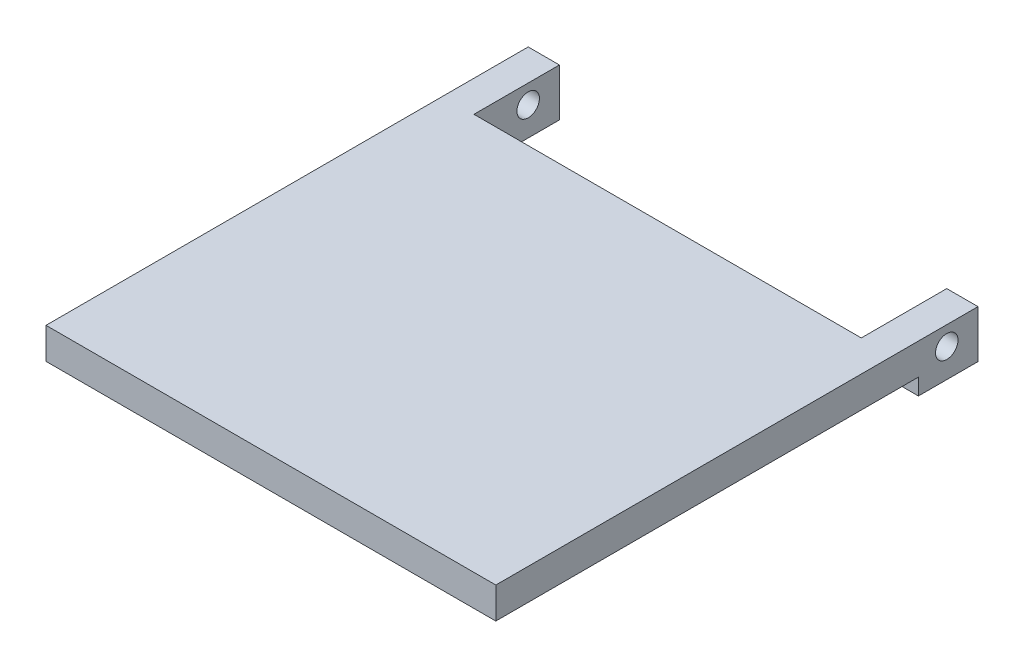
ISO-10303-21;
HEADER;
FILE_DESCRIPTION(('STEP AP214'),'2;1');
FILE_NAME('part.step','',(''),(''),'','','');
FILE_SCHEMA(('AUTOMOTIVE_DESIGN { 1 0 10303 214 1 1 1 1 }'));
ENDSEC;
DATA;
#1=APPLICATION_CONTEXT('core data for automotive mechanical design processes');
#2=APPLICATION_PROTOCOL_DEFINITION('international standard','automotive_design',2000,#1);
#3=PRODUCT_CONTEXT('',#1,'mechanical');
#4=PRODUCT('Part','Part','',(#3));
#5=PRODUCT_RELATED_PRODUCT_CATEGORY('part','',(#4));
#6=PRODUCT_DEFINITION_FORMATION('','',#4);
#7=PRODUCT_DEFINITION_CONTEXT('part definition',#1,'design');
#8=PRODUCT_DEFINITION('design','',#6,#7);
#9=PRODUCT_DEFINITION_SHAPE('','',#8);
#10=(LENGTH_UNIT() NAMED_UNIT(*) SI_UNIT(.MILLI.,.METRE.));
#11=(NAMED_UNIT(*) PLANE_ANGLE_UNIT() SI_UNIT($,.RADIAN.));
#12=(NAMED_UNIT(*) SI_UNIT($,.STERADIAN.) SOLID_ANGLE_UNIT());
#13=UNCERTAINTY_MEASURE_WITH_UNIT(LENGTH_MEASURE(1.E-05),#10,'distance_accuracy_value','');
#14=(GEOMETRIC_REPRESENTATION_CONTEXT(3) GLOBAL_UNCERTAINTY_ASSIGNED_CONTEXT((#13)) GLOBAL_UNIT_ASSIGNED_CONTEXT((#10,
#11,#12)) REPRESENTATION_CONTEXT('',''));
#15=CARTESIAN_POINT('',(0.,0.,0.));
#16=DIRECTION('',(0.,0.,1.));
#17=DIRECTION('',(1.,0.,0.));
#18=AXIS2_PLACEMENT_3D('',#15,#16,#17);
#19=CARTESIAN_POINT('',(67.,5.,0.));
#20=DIRECTION('',(-1.,0.,0.));
#21=DIRECTION('',(0.,0.,1.));
#22=AXIS2_PLACEMENT_3D('',#19,#20,#21);
#23=PLANE('',#22);
#24=DIRECTION('',(0.,1.,0.));
#25=VECTOR('',#24,1.);
#26=CARTESIAN_POINT('',(67.,5.00000000000002,-9.18224698011777));
#27=LINE('',#26,#25);
#28=CARTESIAN_POINT('',(67.,-2.62380116496357,-9.18224698011779));
#29=VERTEX_POINT('',#28);
#30=CARTESIAN_POINT('',(67.,5.,-9.18224698011777));
#31=VERTEX_POINT('',#30);
#32=EDGE_CURVE('E197',#29,#31,#27,.T.);
#33=ORIENTED_EDGE('',*,*,#32,.F.);
#34=DIRECTION('',(0.,0.,-1.));
#35=VECTOR('',#34,1.);
#36=CARTESIAN_POINT('',(67.,-2.62380116496357,-13.6822469801178));
#37=LINE('',#36,#35);
#38=CARTESIAN_POINT('',(67.,-2.62380116496357,0.353150632451109));
#39=VERTEX_POINT('',#38);
#40=EDGE_CURVE('E240',#39,#29,#37,.T.);
#41=ORIENTED_EDGE('',*,*,#40,.F.);
#42=DIRECTION('',(0.,-1.,0.));
#43=VECTOR('',#42,1.);
#44=CARTESIAN_POINT('',(67.,5.,0.35315063245111));
#45=LINE('',#44,#43);
#46=CARTESIAN_POINT('',(67.,0.,0.353150632451111));
#47=VERTEX_POINT('',#46);
#48=EDGE_CURVE('E238',#47,#39,#45,.T.);
#49=ORIENTED_EDGE('',*,*,#48,.F.);
#50=DIRECTION('',(0.,0.,-1.));
#51=VECTOR('',#50,1.);
#52=CARTESIAN_POINT('',(67.,0.,4.5));
#53=LINE('',#52,#51);
#54=CARTESIAN_POINT('',(67.,0.,4.5));
#55=VERTEX_POINT('',#54);
#56=EDGE_CURVE('E183',#55,#47,#53,.T.);
#57=ORIENTED_EDGE('',*,*,#56,.F.);
#58=DIRECTION('',(0.,-1.,0.));
#59=VECTOR('',#58,1.);
#60=CARTESIAN_POINT('',(67.,5.,4.5));
#61=LINE('',#60,#59);
#62=CARTESIAN_POINT('',(67.,5.,4.5));
#63=VERTEX_POINT('',#62);
#64=EDGE_CURVE('E178',#63,#55,#61,.T.);
#65=ORIENTED_EDGE('',*,*,#64,.F.);
#66=DIRECTION('',(0.,0.,-1.));
#67=VECTOR('',#66,1.);
#68=CARTESIAN_POINT('',(67.,5.,0.));
#69=LINE('',#68,#67);
#70=EDGE_CURVE('E176',#63,#31,#69,.T.);
#71=ORIENTED_EDGE('',*,*,#70,.T.);
#72=EDGE_LOOP('',(#33,#41,#49,#57,#65,#71));
#73=FACE_BOUND('',#72,.T.);
#74=CARTESIAN_POINT('',(67.,1.97242221559596,-4.18264024656473));
#75=DIRECTION('',(-1.,0.,0.));
#76=DIRECTION('',(0.,0.,1.));
#77=AXIS2_PLACEMENT_3D('',#74,#75,#76);
#78=CIRCLE('',#77,1.79999999822012);
#79=CARTESIAN_POINT('',(67.,1.97242221559596,-5.98264024478485));
#80=VERTEX_POINT('',#79);
#81=EDGE_CURVE('E218',#80,#80,#78,.T.);
#82=ORIENTED_EDGE('',*,*,#81,.F.);
#83=EDGE_LOOP('',(#82));
#84=FACE_BOUND('',#83,.T.);
#85=ADVANCED_FACE('F65',(#73,#84),#23,.T.);
#86=CARTESIAN_POINT('',(0.,5.,0.));
#87=DIRECTION('',(1.,0.,0.));
#88=DIRECTION('',(0.,0.,-1.));
#89=AXIS2_PLACEMENT_3D('',#86,#87,#88);
#90=PLANE('',#89);
#91=CARTESIAN_POINT('',(0.,1.97242221559596,-4.18264024656473));
#92=DIRECTION('',(1.,0.,0.));
#93=DIRECTION('',(0.,0.,-1.));
#94=AXIS2_PLACEMENT_3D('',#91,#92,#93);
#95=CIRCLE('',#94,1.79999999822012);
#96=CARTESIAN_POINT('',(0.,1.97242221559596,-5.98264024478485));
#97=VERTEX_POINT('',#96);
#98=EDGE_CURVE('E215',#97,#97,#95,.T.);
#99=ORIENTED_EDGE('',*,*,#98,.T.);
#100=EDGE_LOOP('',(#99));
#101=FACE_BOUND('',#100,.T.);
#102=DIRECTION('',(0.,0.,1.));
#103=VECTOR('',#102,1.);
#104=CARTESIAN_POINT('',(0.,5.,0.));
#105=LINE('',#104,#103);
#106=CARTESIAN_POINT('',(0.,5.,-9.18224698011776));
#107=VERTEX_POINT('',#106);
#108=CARTESIAN_POINT('',(0.,5.,68.));
#109=VERTEX_POINT('',#108);
#110=EDGE_CURVE('E73',#107,#109,#105,.T.);
#111=ORIENTED_EDGE('',*,*,#110,.F.);
#112=DIRECTION('',(0.,-1.,0.));
#113=VECTOR('',#112,1.);
#114=CARTESIAN_POINT('',(0.,5.00000000000002,-9.18224698011776));
#115=LINE('',#114,#113);
#116=CARTESIAN_POINT('',(0.,-2.62380116496357,-9.18224698011778));
#117=VERTEX_POINT('',#116);
#118=EDGE_CURVE('E190',#107,#117,#115,.T.);
#119=ORIENTED_EDGE('',*,*,#118,.T.);
#120=DIRECTION('',(0.,0.,1.));
#121=VECTOR('',#120,1.);
#122=CARTESIAN_POINT('',(0.,-2.62380116496357,-13.6822469801178));
#123=LINE('',#122,#121);
#124=CARTESIAN_POINT('',(0.,-2.62380116496357,0.353150632451118));
#125=VERTEX_POINT('',#124);
#126=EDGE_CURVE('E221',#117,#125,#123,.T.);
#127=ORIENTED_EDGE('',*,*,#126,.T.);
#128=DIRECTION('',(0.,1.,0.));
#129=VECTOR('',#128,1.);
#130=CARTESIAN_POINT('',(0.,5.,0.353150632451117));
#131=LINE('',#130,#129);
#132=CARTESIAN_POINT('',(0.,0.,0.353150632451117));
#133=VERTEX_POINT('',#132);
#134=EDGE_CURVE('E225',#125,#133,#131,.T.);
#135=ORIENTED_EDGE('',*,*,#134,.T.);
#136=DIRECTION('',(0.,0.,1.));
#137=VECTOR('',#136,1.);
#138=CARTESIAN_POINT('',(0.,0.,0.));
#139=LINE('',#138,#137);
#140=CARTESIAN_POINT('',(0.,0.,68.));
#141=VERTEX_POINT('',#140);
#142=EDGE_CURVE('E254',#133,#141,#139,.T.);
#143=ORIENTED_EDGE('',*,*,#142,.T.);
#144=DIRECTION('',(0.,-1.,0.));
#145=VECTOR('',#144,1.);
#146=CARTESIAN_POINT('',(0.,0.,68.));
#147=LINE('',#146,#145);
#148=EDGE_CURVE('E199',#109,#141,#147,.T.);
#149=ORIENTED_EDGE('',*,*,#148,.F.);
#150=EDGE_LOOP('',(#111,#119,#127,#135,#143,#149));
#151=FACE_BOUND('',#150,.T.);
#152=ADVANCED_FACE('F269',(#101,#151),#90,.F.);
#153=CARTESIAN_POINT('',(72.,5.,0.));
#154=DIRECTION('',(1.,0.,0.));
#155=DIRECTION('',(0.,0.,-1.));
#156=AXIS2_PLACEMENT_3D('',#153,#154,#155);
#157=PLANE('',#156);
#158=DIRECTION('',(0.,-1.,0.));
#159=VECTOR('',#158,1.);
#160=CARTESIAN_POINT('',(72.,5.00000000000002,-9.18224698011777));
#161=LINE('',#160,#159);
#162=CARTESIAN_POINT('',(72.,5.,-9.18224698011777));
#163=VERTEX_POINT('',#162);
#164=CARTESIAN_POINT('',(72.,-2.62380116496357,-9.18224698011779));
#165=VERTEX_POINT('',#164);
#166=EDGE_CURVE('E80',#163,#165,#161,.T.);
#167=ORIENTED_EDGE('',*,*,#166,.F.);
#168=DIRECTION('',(0.,0.,1.));
#169=VECTOR('',#168,1.);
#170=CARTESIAN_POINT('',(72.,5.,0.));
#171=LINE('',#170,#169);
#172=CARTESIAN_POINT('',(72.,5.,68.));
#173=VERTEX_POINT('',#172);
#174=EDGE_CURVE('E252',#163,#173,#171,.T.);
#175=ORIENTED_EDGE('',*,*,#174,.T.);
#176=DIRECTION('',(0.,1.,0.));
#177=VECTOR('',#176,1.);
#178=CARTESIAN_POINT('',(72.,0.,68.));
#179=LINE('',#178,#177);
#180=CARTESIAN_POINT('',(72.,0.,68.));
#181=VERTEX_POINT('',#180);
#182=EDGE_CURVE('E205',#181,#173,#179,.T.);
#183=ORIENTED_EDGE('',*,*,#182,.F.);
#184=DIRECTION('',(0.,0.,1.));
#185=VECTOR('',#184,1.);
#186=CARTESIAN_POINT('',(72.,0.,0.));
#187=LINE('',#186,#185);
#188=CARTESIAN_POINT('',(72.,0.,0.35315063245111));
#189=VERTEX_POINT('',#188);
#190=EDGE_CURVE('E161',#189,#181,#187,.T.);
#191=ORIENTED_EDGE('',*,*,#190,.F.);
#192=DIRECTION('',(0.,-1.,0.));
#193=VECTOR('',#192,1.);
#194=CARTESIAN_POINT('',(72.,5.,0.35315063245111));
#195=LINE('',#194,#193);
#196=CARTESIAN_POINT('',(72.,-2.62380116496357,0.353150632451109));
#197=VERTEX_POINT('',#196);
#198=EDGE_CURVE('E237',#189,#197,#195,.T.);
#199=ORIENTED_EDGE('',*,*,#198,.T.);
#200=DIRECTION('',(0.,0.,-1.));
#201=VECTOR('',#200,1.);
#202=CARTESIAN_POINT('',(72.,-2.62380116496357,-13.6822469801178));
#203=LINE('',#202,#201);
#204=EDGE_CURVE('E241',#197,#165,#203,.T.);
#205=ORIENTED_EDGE('',*,*,#204,.T.);
#206=EDGE_LOOP('',(#167,#175,#183,#191,#199,#205));
#207=FACE_BOUND('',#206,.T.);
#208=CARTESIAN_POINT('',(72.,1.97242221559596,-4.18264024656473));
#209=DIRECTION('',(1.,0.,0.));
#210=DIRECTION('',(0.,0.,-1.));
#211=AXIS2_PLACEMENT_3D('',#208,#209,#210);
#212=CIRCLE('',#211,1.79999999822012);
#213=CARTESIAN_POINT('',(72.,1.97242221559596,-5.98264024478485));
#214=VERTEX_POINT('',#213);
#215=EDGE_CURVE('E211',#214,#214,#212,.T.);
#216=ORIENTED_EDGE('',*,*,#215,.F.);
#217=EDGE_LOOP('',(#216));
#218=FACE_BOUND('',#217,.T.);
#219=ADVANCED_FACE('F272',(#207,#218),#157,.T.);
#220=CARTESIAN_POINT('',(0.,0.,0.));
#221=DIRECTION('',(0.,1.,0.));
#222=DIRECTION('',(0.,0.,1.));
#223=AXIS2_PLACEMENT_3D('',#220,#221,#222);
#224=PLANE('',#223);
#225=DIRECTION('',(1.,0.,0.));
#226=VECTOR('',#225,1.);
#227=CARTESIAN_POINT('',(0.,0.,0.353150632451117));
#228=LINE('',#227,#226);
#229=CARTESIAN_POINT('',(5.,0.,0.353150632451117));
#230=VERTEX_POINT('',#229);
#231=EDGE_CURVE('E234',#133,#230,#228,.T.);
#232=ORIENTED_EDGE('',*,*,#231,.T.);
#233=DIRECTION('',(0.,0.,-1.));
#234=VECTOR('',#233,1.);
#235=CARTESIAN_POINT('',(5.,0.,4.5));
#236=LINE('',#235,#234);
#237=CARTESIAN_POINT('',(5.,0.,4.5));
#238=VERTEX_POINT('',#237);
#239=EDGE_CURVE('E184',#238,#230,#236,.T.);
#240=ORIENTED_EDGE('',*,*,#239,.F.);
#241=DIRECTION('',(-1.,0.,0.));
#242=VECTOR('',#241,1.);
#243=CARTESIAN_POINT('',(5.,0.,4.5));
#244=LINE('',#243,#242);
#245=EDGE_CURVE('E170',#55,#238,#244,.T.);
#246=ORIENTED_EDGE('',*,*,#245,.F.);
#247=ORIENTED_EDGE('',*,*,#56,.T.);
#248=DIRECTION('',(1.,0.,0.));
#249=VECTOR('',#248,1.);
#250=CARTESIAN_POINT('',(0.,0.,0.35315063245111));
#251=LINE('',#250,#249);
#252=EDGE_CURVE('E162',#47,#189,#251,.T.);
#253=ORIENTED_EDGE('',*,*,#252,.T.);
#254=ORIENTED_EDGE('',*,*,#190,.T.);
#255=DIRECTION('',(1.,0.,0.));
#256=VECTOR('',#255,1.);
#257=CARTESIAN_POINT('',(0.,0.,68.));
#258=LINE('',#257,#256);
#259=EDGE_CURVE('E202',#141,#181,#258,.T.);
#260=ORIENTED_EDGE('',*,*,#259,.F.);
#261=ORIENTED_EDGE('',*,*,#142,.F.);
#262=EDGE_LOOP('',(#232,#240,#246,#247,#253,#254,#260,#261));
#263=FACE_BOUND('',#262,.T.);
#264=ADVANCED_FACE('F291',(#263),#224,.F.);
#265=CARTESIAN_POINT('',(0.,5.,0.));
#266=DIRECTION('',(0.,1.,0.));
#267=DIRECTION('',(0.,0.,1.));
#268=AXIS2_PLACEMENT_3D('',#265,#266,#267);
#269=PLANE('',#268);
#270=DIRECTION('',(1.,0.,0.));
#271=VECTOR('',#270,1.);
#272=CARTESIAN_POINT('',(5.,5.,4.5));
#273=LINE('',#272,#271);
#274=CARTESIAN_POINT('',(5.,5.,4.5));
#275=VERTEX_POINT('',#274);
#276=EDGE_CURVE('E168',#275,#63,#273,.T.);
#277=ORIENTED_EDGE('',*,*,#276,.F.);
#278=DIRECTION('',(0.,0.,-1.));
#279=VECTOR('',#278,1.);
#280=CARTESIAN_POINT('',(5.,5.,0.));
#281=LINE('',#280,#279);
#282=CARTESIAN_POINT('',(5.,5.,-9.18224698011776));
#283=VERTEX_POINT('',#282);
#284=EDGE_CURVE('E152',#275,#283,#281,.T.);
#285=ORIENTED_EDGE('',*,*,#284,.T.);
#286=DIRECTION('',(1.,0.,0.));
#287=VECTOR('',#286,1.);
#288=CARTESIAN_POINT('',(0.,5.,-9.18224698011776));
#289=LINE('',#288,#287);
#290=EDGE_CURVE('E188',#107,#283,#289,.T.);
#291=ORIENTED_EDGE('',*,*,#290,.F.);
#292=ORIENTED_EDGE('',*,*,#110,.T.);
#293=DIRECTION('',(-1.,0.,0.));
#294=VECTOR('',#293,1.);
#295=CARTESIAN_POINT('',(0.,5.,68.));
#296=LINE('',#295,#294);
#297=EDGE_CURVE('E208',#173,#109,#296,.T.);
#298=ORIENTED_EDGE('',*,*,#297,.F.);
#299=ORIENTED_EDGE('',*,*,#174,.F.);
#300=EDGE_CURVE('E191',#31,#163,#289,.T.);
#301=ORIENTED_EDGE('',*,*,#300,.F.);
#302=ORIENTED_EDGE('',*,*,#70,.F.);
#303=EDGE_LOOP('',(#277,#285,#291,#292,#298,#299,#301,#302));
#304=FACE_BOUND('',#303,.T.);
#305=ADVANCED_FACE('F173',(#304),#269,.T.);
#306=CARTESIAN_POINT('',(5.,5.,0.));
#307=DIRECTION('',(-1.,0.,0.));
#308=DIRECTION('',(0.,0.,1.));
#309=AXIS2_PLACEMENT_3D('',#306,#307,#308);
#310=PLANE('',#309);
#311=ORIENTED_EDGE('',*,*,#239,.T.);
#312=DIRECTION('',(0.,1.,0.));
#313=VECTOR('',#312,1.);
#314=CARTESIAN_POINT('',(5.,5.,0.353150632451116));
#315=LINE('',#314,#313);
#316=CARTESIAN_POINT('',(5.,-2.62380116496357,0.353150632451117));
#317=VERTEX_POINT('',#316);
#318=EDGE_CURVE('E224',#317,#230,#315,.T.);
#319=ORIENTED_EDGE('',*,*,#318,.F.);
#320=DIRECTION('',(0.,0.,1.));
#321=VECTOR('',#320,1.);
#322=CARTESIAN_POINT('',(5.,-2.62380116496357,-13.6822469801178));
#323=LINE('',#322,#321);
#324=CARTESIAN_POINT('',(5.,-2.62380116496357,-9.18224698011778));
#325=VERTEX_POINT('',#324);
#326=EDGE_CURVE('E222',#325,#317,#323,.T.);
#327=ORIENTED_EDGE('',*,*,#326,.F.);
#328=DIRECTION('',(0.,1.,0.));
#329=VECTOR('',#328,1.);
#330=CARTESIAN_POINT('',(5.,5.00000000000002,-9.18224698011776));
#331=LINE('',#330,#329);
#332=EDGE_CURVE('E87',#325,#283,#331,.T.);
#333=ORIENTED_EDGE('',*,*,#332,.T.);
#334=ORIENTED_EDGE('',*,*,#284,.F.);
#335=DIRECTION('',(0.,1.,0.));
#336=VECTOR('',#335,1.);
#337=CARTESIAN_POINT('',(5.,5.,4.5));
#338=LINE('',#337,#336);
#339=EDGE_CURVE('E155',#238,#275,#338,.T.);
#340=ORIENTED_EDGE('',*,*,#339,.F.);
#341=EDGE_LOOP('',(#311,#319,#327,#333,#334,#340));
#342=FACE_BOUND('',#341,.T.);
#343=CARTESIAN_POINT('',(5.,1.97242221559596,-4.18264024656473));
#344=DIRECTION('',(-1.,0.,0.));
#345=DIRECTION('',(0.,0.,1.));
#346=AXIS2_PLACEMENT_3D('',#343,#344,#345);
#347=CIRCLE('',#346,1.79999999822012);
#348=CARTESIAN_POINT('',(5.,1.97242221559596,-5.98264024478485));
#349=VERTEX_POINT('',#348);
#350=EDGE_CURVE('E214',#349,#349,#347,.T.);
#351=ORIENTED_EDGE('',*,*,#350,.T.);
#352=EDGE_LOOP('',(#351));
#353=FACE_BOUND('',#352,.T.);
#354=ADVANCED_FACE('F67',(#342,#353),#310,.F.);
#355=CARTESIAN_POINT('',(67.,5.,0.35315063245111));
#356=DIRECTION('',(0.,0.,1.));
#357=DIRECTION('',(0.,-1.,0.));
#358=AXIS2_PLACEMENT_3D('',#355,#356,#357);
#359=PLANE('',#358);
#360=ORIENTED_EDGE('',*,*,#252,.F.);
#361=ORIENTED_EDGE('',*,*,#48,.T.);
#362=DIRECTION('',(1.,0.,0.));
#363=VECTOR('',#362,1.);
#364=CARTESIAN_POINT('',(67.,-2.62380116496357,0.353150632451109));
#365=LINE('',#364,#363);
#366=EDGE_CURVE('E244',#39,#197,#365,.T.);
#367=ORIENTED_EDGE('',*,*,#366,.T.);
#368=ORIENTED_EDGE('',*,*,#198,.F.);
#369=EDGE_LOOP('',(#360,#361,#367,#368));
#370=FACE_BOUND('',#369,.T.);
#371=ADVANCED_FACE('F324',(#370),#359,.T.);
#372=CARTESIAN_POINT('',(67.,-2.62380116496357,-13.6822469801178));
#373=DIRECTION('',(0.,-1.,0.));
#374=DIRECTION('',(0.,0.,-1.));
#375=AXIS2_PLACEMENT_3D('',#372,#373,#374);
#376=PLANE('',#375);
#377=DIRECTION('',(-1.,0.,0.));
#378=VECTOR('',#377,1.);
#379=CARTESIAN_POINT('',(67.,-2.62380116496357,-9.18224698011779));
#380=LINE('',#379,#378);
#381=EDGE_CURVE('E194',#165,#29,#380,.T.);
#382=ORIENTED_EDGE('',*,*,#381,.F.);
#383=ORIENTED_EDGE('',*,*,#204,.F.);
#384=ORIENTED_EDGE('',*,*,#366,.F.);
#385=ORIENTED_EDGE('',*,*,#40,.T.);
#386=EDGE_LOOP('',(#382,#383,#384,#385));
#387=FACE_BOUND('',#386,.T.);
#388=ADVANCED_FACE('F327',(#387),#376,.T.);
#389=CARTESIAN_POINT('',(5.,5.,0.353150632451116));
#390=DIRECTION('',(0.,0.,1.));
#391=DIRECTION('',(1.,0.,0.));
#392=AXIS2_PLACEMENT_3D('',#389,#390,#391);
#393=PLANE('',#392);
#394=ORIENTED_EDGE('',*,*,#231,.F.);
#395=ORIENTED_EDGE('',*,*,#134,.F.);
#396=DIRECTION('',(-1.,0.,0.));
#397=VECTOR('',#396,1.);
#398=CARTESIAN_POINT('',(5.,-2.62380116496357,0.353150632451117));
#399=LINE('',#398,#397);
#400=EDGE_CURVE('E228',#317,#125,#399,.T.);
#401=ORIENTED_EDGE('',*,*,#400,.F.);
#402=ORIENTED_EDGE('',*,*,#318,.T.);
#403=EDGE_LOOP('',(#394,#395,#401,#402));
#404=FACE_BOUND('',#403,.T.);
#405=ADVANCED_FACE('F297',(#404),#393,.T.);
#406=CARTESIAN_POINT('',(5.,-2.62380116496357,-13.6822469801178));
#407=DIRECTION('',(0.,-1.,0.));
#408=DIRECTION('',(0.,0.,-1.));
#409=AXIS2_PLACEMENT_3D('',#406,#407,#408);
#410=PLANE('',#409);
#411=DIRECTION('',(-1.,0.,0.));
#412=VECTOR('',#411,1.);
#413=CARTESIAN_POINT('',(5.,-2.62380116496357,-9.18224698011778));
#414=LINE('',#413,#412);
#415=EDGE_CURVE('E12',#325,#117,#414,.T.);
#416=ORIENTED_EDGE('',*,*,#415,.F.);
#417=ORIENTED_EDGE('',*,*,#326,.T.);
#418=ORIENTED_EDGE('',*,*,#400,.T.);
#419=ORIENTED_EDGE('',*,*,#126,.F.);
#420=EDGE_LOOP('',(#416,#417,#418,#419));
#421=FACE_BOUND('',#420,.T.);
#422=ADVANCED_FACE('F265',(#421),#410,.T.);
#423=CARTESIAN_POINT('',(-23.,1.97242221559596,-4.18264024656473));
#424=DIRECTION('',(1.,0.,0.));
#425=DIRECTION('',(0.,0.,-1.));
#426=AXIS2_PLACEMENT_3D('',#423,#424,#425);
#427=CYLINDRICAL_SURFACE('',#426,1.79999999822012);
#428=CARTESIAN_POINT('',(5.,1.97242221559596,-5.98264024478485));
#429=CARTESIAN_POINT('',(4.94791666666667,1.97242221559596,-5.98264024478485));
#430=CARTESIAN_POINT('',(4.89583333333333,1.97242221559596,-5.98264024478485));
#431=CARTESIAN_POINT('',(4.79166666666667,1.97242221559596,-5.98264024478485));
#432=CARTESIAN_POINT('',(4.73958333333333,1.97242221559596,-5.98264024478485));
#433=CARTESIAN_POINT('',(4.63541666666667,1.97242221559596,-5.98264024478485));
#434=CARTESIAN_POINT('',(4.58333333333333,1.97242221559596,-5.98264024478485));
#435=CARTESIAN_POINT('',(4.47916666666667,1.97242221559596,-5.98264024478485));
#436=CARTESIAN_POINT('',(4.42708333333333,1.97242221559596,-5.98264024478485));
#437=CARTESIAN_POINT('',(4.32291666666667,1.97242221559596,-5.98264024478485));
#438=CARTESIAN_POINT('',(4.27083333333333,1.97242221559596,-5.98264024478485));
#439=CARTESIAN_POINT('',(4.16666666666667,1.97242221559596,-5.98264024478485));
#440=CARTESIAN_POINT('',(4.11458333333333,1.97242221559596,-5.98264024478485));
#441=CARTESIAN_POINT('',(4.01041666666667,1.97242221559596,-5.98264024478485));
#442=CARTESIAN_POINT('',(3.95833333333333,1.97242221559596,-5.98264024478485));
#443=CARTESIAN_POINT('',(3.85416666666667,1.97242221559596,-5.98264024478485));
#444=CARTESIAN_POINT('',(3.80208333333333,1.97242221559596,-5.98264024478485));
#445=CARTESIAN_POINT('',(3.69791666666667,1.97242221559596,-5.98264024478485));
#446=CARTESIAN_POINT('',(3.64583333333333,1.97242221559596,-5.98264024478485));
#447=CARTESIAN_POINT('',(3.54166666666667,1.97242221559596,-5.98264024478485));
#448=CARTESIAN_POINT('',(3.48958333333333,1.97242221559596,-5.98264024478485));
#449=CARTESIAN_POINT('',(3.38541666666667,1.97242221559596,-5.98264024478485));
#450=CARTESIAN_POINT('',(3.33333333333333,1.97242221559596,-5.98264024478485));
#451=CARTESIAN_POINT('',(3.22916666666667,1.97242221559596,-5.98264024478485));
#452=CARTESIAN_POINT('',(3.17708333333333,1.97242221559596,-5.98264024478485));
#453=CARTESIAN_POINT('',(3.07291666666667,1.97242221559596,-5.98264024478485));
#454=CARTESIAN_POINT('',(3.02083333333333,1.97242221559596,-5.98264024478485));
#455=CARTESIAN_POINT('',(2.91666666666667,1.97242221559596,-5.98264024478485));
#456=CARTESIAN_POINT('',(2.86458333333333,1.97242221559596,-5.98264024478485));
#457=CARTESIAN_POINT('',(2.76041666666667,1.97242221559596,-5.98264024478485));
#458=CARTESIAN_POINT('',(2.70833333333333,1.97242221559596,-5.98264024478485));
#459=CARTESIAN_POINT('',(2.60416666666667,1.97242221559596,-5.98264024478485));
#460=CARTESIAN_POINT('',(2.55208333333333,1.97242221559596,-5.98264024478485));
#461=CARTESIAN_POINT('',(2.44791666666667,1.97242221559596,-5.98264024478485));
#462=CARTESIAN_POINT('',(2.39583333333333,1.97242221559596,-5.98264024478485));
#463=CARTESIAN_POINT('',(2.29166666666667,1.97242221559596,-5.98264024478485));
#464=CARTESIAN_POINT('',(2.23958333333333,1.97242221559596,-5.98264024478485));
#465=CARTESIAN_POINT('',(2.13541666666667,1.97242221559596,-5.98264024478485));
#466=CARTESIAN_POINT('',(2.08333333333333,1.97242221559596,-5.98264024478485));
#467=CARTESIAN_POINT('',(1.97916666666667,1.97242221559596,-5.98264024478485));
#468=CARTESIAN_POINT('',(1.92708333333333,1.97242221559596,-5.98264024478485));
#469=CARTESIAN_POINT('',(1.82291666666666,1.97242221559596,-5.98264024478485));
#470=CARTESIAN_POINT('',(1.77083333333333,1.97242221559596,-5.98264024478485));
#471=CARTESIAN_POINT('',(1.66666666666666,1.97242221559596,-5.98264024478485));
#472=CARTESIAN_POINT('',(1.61458333333333,1.97242221559596,-5.98264024478485));
#473=CARTESIAN_POINT('',(1.51041666666666,1.97242221559596,-5.98264024478485));
#474=CARTESIAN_POINT('',(1.45833333333333,1.97242221559596,-5.98264024478485));
#475=CARTESIAN_POINT('',(1.35416666666666,1.97242221559596,-5.98264024478485));
#476=CARTESIAN_POINT('',(1.30208333333333,1.97242221559596,-5.98264024478485));
#477=CARTESIAN_POINT('',(1.19791666666666,1.97242221559596,-5.98264024478485));
#478=CARTESIAN_POINT('',(1.14583333333333,1.97242221559596,-5.98264024478485));
#479=CARTESIAN_POINT('',(1.04166666666666,1.97242221559596,-5.98264024478485));
#480=CARTESIAN_POINT('',(0.989583333333331,1.97242221559596,-5.98264024478485));
#481=CARTESIAN_POINT('',(0.885416666666664,1.97242221559596,-5.98264024478485));
#482=CARTESIAN_POINT('',(0.833333333333331,1.97242221559596,-5.98264024478485));
#483=CARTESIAN_POINT('',(0.729166666666664,1.97242221559596,-5.98264024478485));
#484=CARTESIAN_POINT('',(0.67708333333333,1.97242221559596,-5.98264024478485));
#485=CARTESIAN_POINT('',(0.572916666666664,1.97242221559596,-5.98264024478485));
#486=CARTESIAN_POINT('',(0.52083333333333,1.97242221559596,-5.98264024478485));
#487=CARTESIAN_POINT('',(0.416666666666664,1.97242221559596,-5.98264024478485));
#488=CARTESIAN_POINT('',(0.36458333333333,1.97242221559596,-5.98264024478485));
#489=CARTESIAN_POINT('',(0.260416666666663,1.97242221559596,-5.98264024478485));
#490=CARTESIAN_POINT('',(0.20833333333333,1.97242221559596,-5.98264024478485));
#491=CARTESIAN_POINT('',(0.104166666666663,1.97242221559596,-5.98264024478485));
#492=CARTESIAN_POINT('',(0.05208333333333,1.97242221559596,-5.98264024478485));
#493=CARTESIAN_POINT('',(0.,1.97242221559596,-5.98264024478485));
#494=B_SPLINE_CURVE_WITH_KNOTS('',3,(#428,#429,#430,#431,#432,#433,#434,#435,#436,#437,#438,
#439,#440,#441,#442,#443,#444,#445,#446,#447,#448,#449,#450,#451,#452,#453,#454,#455,#456,#457,
#458,#459,#460,#461,#462,#463,#464,#465,#466,#467,#468,#469,#470,#471,#472,#473,#474,#475,#476,
#477,#478,#479,#480,#481,#482,#483,#484,#485,#486,#487,#488,#489,#490,#491,#492,#493),
.UNSPECIFIED.,.F.,.F.,(4,2,2,2,2,2,2,2,2,2,2,2,2,2,2,2,2,2,2,2,2,2,2,2,2,2,2,2,2,2,2,2,4),(0.,
0.15625,0.3125,0.46875,0.625000000000001,0.781250000000001,0.937500000000001,1.09375,1.25,
1.40625,1.5625,1.71875,1.875,2.03125,2.1875,2.34375,2.5,2.65625,2.8125,2.96875,3.125,3.28125,
3.4375,3.59375,3.75,3.90625,4.0625,4.21875,4.375,4.53125,4.6875,4.84375,5.),.UNSPECIFIED.);
#495=EDGE_CURVE('BSEAM261',#349,#97,#494,.T.);
#496=ORIENTED_EDGE('',*,*,#350,.F.);
#497=ORIENTED_EDGE('',*,*,#98,.F.);
#498=ORIENTED_EDGE('',*,*,#495,.T.);
#499=ORIENTED_EDGE('',*,*,#495,.F.);
#500=EDGE_LOOP('',(#496,#498,#497,#499));
#501=FACE_BOUND('',#500,.T.);
#502=ADVANCED_FACE('F261',(#501),#427,.F.);
#503=CARTESIAN_POINT('',(67.,1.97242221559596,-5.98264024478485));
#504=CARTESIAN_POINT('',(67.0520833333333,1.97242221559596,-5.98264024478485));
#505=CARTESIAN_POINT('',(67.1041666666667,1.97242221559596,-5.98264024478485));
#506=CARTESIAN_POINT('',(67.2083333333333,1.97242221559596,-5.98264024478485));
#507=CARTESIAN_POINT('',(67.2604166666667,1.97242221559596,-5.98264024478485));
#508=CARTESIAN_POINT('',(67.3645833333333,1.97242221559596,-5.98264024478485));
#509=CARTESIAN_POINT('',(67.4166666666667,1.97242221559596,-5.98264024478485));
#510=CARTESIAN_POINT('',(67.5208333333333,1.97242221559596,-5.98264024478485));
#511=CARTESIAN_POINT('',(67.5729166666667,1.97242221559596,-5.98264024478485));
#512=CARTESIAN_POINT('',(67.6770833333333,1.97242221559596,-5.98264024478485));
#513=CARTESIAN_POINT('',(67.7291666666667,1.97242221559596,-5.98264024478485));
#514=CARTESIAN_POINT('',(67.8333333333333,1.97242221559596,-5.98264024478485));
#515=CARTESIAN_POINT('',(67.8854166666667,1.97242221559596,-5.98264024478485));
#516=CARTESIAN_POINT('',(67.9895833333333,1.97242221559596,-5.98264024478485));
#517=CARTESIAN_POINT('',(68.0416666666667,1.97242221559596,-5.98264024478485));
#518=CARTESIAN_POINT('',(68.1458333333333,1.97242221559596,-5.98264024478485));
#519=CARTESIAN_POINT('',(68.1979166666667,1.97242221559596,-5.98264024478485));
#520=CARTESIAN_POINT('',(68.3020833333333,1.97242221559596,-5.98264024478485));
#521=CARTESIAN_POINT('',(68.3541666666667,1.97242221559596,-5.98264024478485));
#522=CARTESIAN_POINT('',(68.4583333333333,1.97242221559596,-5.98264024478485));
#523=CARTESIAN_POINT('',(68.5104166666667,1.97242221559596,-5.98264024478485));
#524=CARTESIAN_POINT('',(68.6145833333333,1.97242221559596,-5.98264024478485));
#525=CARTESIAN_POINT('',(68.6666666666667,1.97242221559596,-5.98264024478485));
#526=CARTESIAN_POINT('',(68.7708333333333,1.97242221559596,-5.98264024478485));
#527=CARTESIAN_POINT('',(68.8229166666667,1.97242221559596,-5.98264024478485));
#528=CARTESIAN_POINT('',(68.9270833333333,1.97242221559596,-5.98264024478485));
#529=CARTESIAN_POINT('',(68.9791666666667,1.97242221559596,-5.98264024478485));
#530=CARTESIAN_POINT('',(69.0833333333333,1.97242221559596,-5.98264024478485));
#531=CARTESIAN_POINT('',(69.1354166666667,1.97242221559596,-5.98264024478485));
#532=CARTESIAN_POINT('',(69.2395833333333,1.97242221559596,-5.98264024478485));
#533=CARTESIAN_POINT('',(69.2916666666667,1.97242221559596,-5.98264024478485));
#534=CARTESIAN_POINT('',(69.3958333333333,1.97242221559596,-5.98264024478485));
#535=CARTESIAN_POINT('',(69.4479166666667,1.97242221559596,-5.98264024478485));
#536=CARTESIAN_POINT('',(69.5520833333333,1.97242221559596,-5.98264024478485));
#537=CARTESIAN_POINT('',(69.6041666666667,1.97242221559596,-5.98264024478485));
#538=CARTESIAN_POINT('',(69.7083333333333,1.97242221559596,-5.98264024478485));
#539=CARTESIAN_POINT('',(69.7604166666667,1.97242221559596,-5.98264024478485));
#540=CARTESIAN_POINT('',(69.8645833333333,1.97242221559596,-5.98264024478485));
#541=CARTESIAN_POINT('',(69.9166666666667,1.97242221559596,-5.98264024478485));
#542=CARTESIAN_POINT('',(70.0208333333333,1.97242221559596,-5.98264024478485));
#543=CARTESIAN_POINT('',(70.0729166666667,1.97242221559596,-5.98264024478485));
#544=CARTESIAN_POINT('',(70.1770833333333,1.97242221559596,-5.98264024478485));
#545=CARTESIAN_POINT('',(70.2291666666667,1.97242221559596,-5.98264024478485));
#546=CARTESIAN_POINT('',(70.3333333333333,1.97242221559596,-5.98264024478485));
#547=CARTESIAN_POINT('',(70.3854166666667,1.97242221559596,-5.98264024478485));
#548=CARTESIAN_POINT('',(70.4895833333333,1.97242221559596,-5.98264024478485));
#549=CARTESIAN_POINT('',(70.5416666666667,1.97242221559596,-5.98264024478485));
#550=CARTESIAN_POINT('',(70.6458333333333,1.97242221559596,-5.98264024478485));
#551=CARTESIAN_POINT('',(70.6979166666667,1.97242221559596,-5.98264024478485));
#552=CARTESIAN_POINT('',(70.8020833333333,1.97242221559596,-5.98264024478485));
#553=CARTESIAN_POINT('',(70.8541666666667,1.97242221559596,-5.98264024478485));
#554=CARTESIAN_POINT('',(70.9583333333333,1.97242221559596,-5.98264024478485));
#555=CARTESIAN_POINT('',(71.0104166666667,1.97242221559596,-5.98264024478485));
#556=CARTESIAN_POINT('',(71.1145833333333,1.97242221559596,-5.98264024478485));
#557=CARTESIAN_POINT('',(71.1666666666667,1.97242221559596,-5.98264024478485));
#558=CARTESIAN_POINT('',(71.2708333333333,1.97242221559596,-5.98264024478485));
#559=CARTESIAN_POINT('',(71.3229166666667,1.97242221559596,-5.98264024478485));
#560=CARTESIAN_POINT('',(71.4270833333333,1.97242221559596,-5.98264024478485));
#561=CARTESIAN_POINT('',(71.4791666666667,1.97242221559596,-5.98264024478485));
#562=CARTESIAN_POINT('',(71.5833333333333,1.97242221559596,-5.98264024478485));
#563=CARTESIAN_POINT('',(71.6354166666667,1.97242221559596,-5.98264024478485));
#564=CARTESIAN_POINT('',(71.7395833333333,1.97242221559596,-5.98264024478485));
#565=CARTESIAN_POINT('',(71.7916666666667,1.97242221559596,-5.98264024478485));
#566=CARTESIAN_POINT('',(71.8958333333333,1.97242221559596,-5.98264024478485));
#567=CARTESIAN_POINT('',(71.9479166666667,1.97242221559596,-5.98264024478485));
#568=CARTESIAN_POINT('',(72.,1.97242221559596,-5.98264024478485));
#569=B_SPLINE_CURVE_WITH_KNOTS('',3,(#503,#504,#505,#506,#507,#508,#509,#510,#511,#512,#513,
#514,#515,#516,#517,#518,#519,#520,#521,#522,#523,#524,#525,#526,#527,#528,#529,#530,#531,#532,
#533,#534,#535,#536,#537,#538,#539,#540,#541,#542,#543,#544,#545,#546,#547,#548,#549,#550,#551,
#552,#553,#554,#555,#556,#557,#558,#559,#560,#561,#562,#563,#564,#565,#566,#567,#568),
.UNSPECIFIED.,.F.,.F.,(4,2,2,2,2,2,2,2,2,2,2,2,2,2,2,2,2,2,2,2,2,2,2,2,2,2,2,2,2,2,2,2,4),(0.,
0.156249999999997,0.312499999999993,0.468750000000004,0.625000000000001,0.781249999999997,
0.937500000000008,1.09375,1.25,1.40625,1.56249999999999,1.71875,1.875,2.03125,2.18750000000001,
2.34375000000001,2.5,2.65625,2.8125,2.96875000000001,3.125,3.28125,3.43750000000001,
3.59375000000001,3.75,3.90625,4.0625,4.21875000000001,4.375,4.53125,4.68750000000001,
4.84375000000001,5.),.UNSPECIFIED.);
#570=EDGE_CURVE('BSEAM264',#80,#214,#569,.T.);
#571=ORIENTED_EDGE('',*,*,#81,.T.);
#572=ORIENTED_EDGE('',*,*,#215,.T.);
#573=ORIENTED_EDGE('',*,*,#570,.T.);
#574=ORIENTED_EDGE('',*,*,#570,.F.);
#575=EDGE_LOOP('',(#571,#573,#572,#574));
#576=FACE_BOUND('',#575,.T.);
#577=ADVANCED_FACE('F264',(#576),#427,.F.);
#578=CARTESIAN_POINT('',(0.,0.,68.));
#579=DIRECTION('',(0.,0.,-1.));
#580=DIRECTION('',(-1.,0.,0.));
#581=AXIS2_PLACEMENT_3D('',#578,#579,#580);
#582=PLANE('',#581);
#583=ORIENTED_EDGE('',*,*,#148,.T.);
#584=ORIENTED_EDGE('',*,*,#259,.T.);
#585=ORIENTED_EDGE('',*,*,#182,.T.);
#586=ORIENTED_EDGE('',*,*,#297,.T.);
#587=EDGE_LOOP('',(#583,#584,#585,#586));
#588=FACE_BOUND('',#587,.T.);
#589=ADVANCED_FACE('F280',(#588),#582,.F.);
#590=CARTESIAN_POINT('',(0.,0.,-9.18224698011778));
#591=DIRECTION('',(0.,0.,1.));
#592=DIRECTION('',(0.,-1.,0.));
#593=AXIS2_PLACEMENT_3D('',#590,#591,#592);
#594=PLANE('',#593);
#595=ORIENTED_EDGE('',*,*,#290,.T.);
#596=ORIENTED_EDGE('',*,*,#332,.F.);
#597=ORIENTED_EDGE('',*,*,#415,.T.);
#598=ORIENTED_EDGE('',*,*,#118,.F.);
#599=EDGE_LOOP('',(#595,#596,#597,#598));
#600=FACE_BOUND('',#599,.T.);
#601=ADVANCED_FACE('F300',(#600),#594,.F.);
#602=ORIENTED_EDGE('',*,*,#300,.T.);
#603=ORIENTED_EDGE('',*,*,#166,.T.);
#604=ORIENTED_EDGE('',*,*,#381,.T.);
#605=ORIENTED_EDGE('',*,*,#32,.T.);
#606=EDGE_LOOP('',(#602,#603,#604,#605));
#607=FACE_BOUND('',#606,.T.);
#608=ADVANCED_FACE('F302',(#607),#594,.F.);
#609=CARTESIAN_POINT('',(0.,0.,4.5));
#610=DIRECTION('',(0.,0.,1.));
#611=DIRECTION('',(1.,0.,0.));
#612=AXIS2_PLACEMENT_3D('',#609,#610,#611);
#613=PLANE('',#612);
#614=ORIENTED_EDGE('',*,*,#339,.T.);
#615=ORIENTED_EDGE('',*,*,#276,.T.);
#616=ORIENTED_EDGE('',*,*,#64,.T.);
#617=ORIENTED_EDGE('',*,*,#245,.T.);
#618=EDGE_LOOP('',(#614,#615,#616,#617));
#619=FACE_BOUND('',#618,.T.);
#620=ADVANCED_FACE('F166',(#619),#613,.F.);
#621=CLOSED_SHELL('',(#85,#152,#219,#264,#305,#354,#371,#388,#405,#422,#502,#577,#589,#601,#608,#620));
#622=MANIFOLD_SOLID_BREP('B2',#621);
#623=ADVANCED_BREP_SHAPE_REPRESENTATION('',(#18,#622),#14);
#624=SHAPE_DEFINITION_REPRESENTATION(#9,#623);
ENDSEC;
END-ISO-10303-21;
